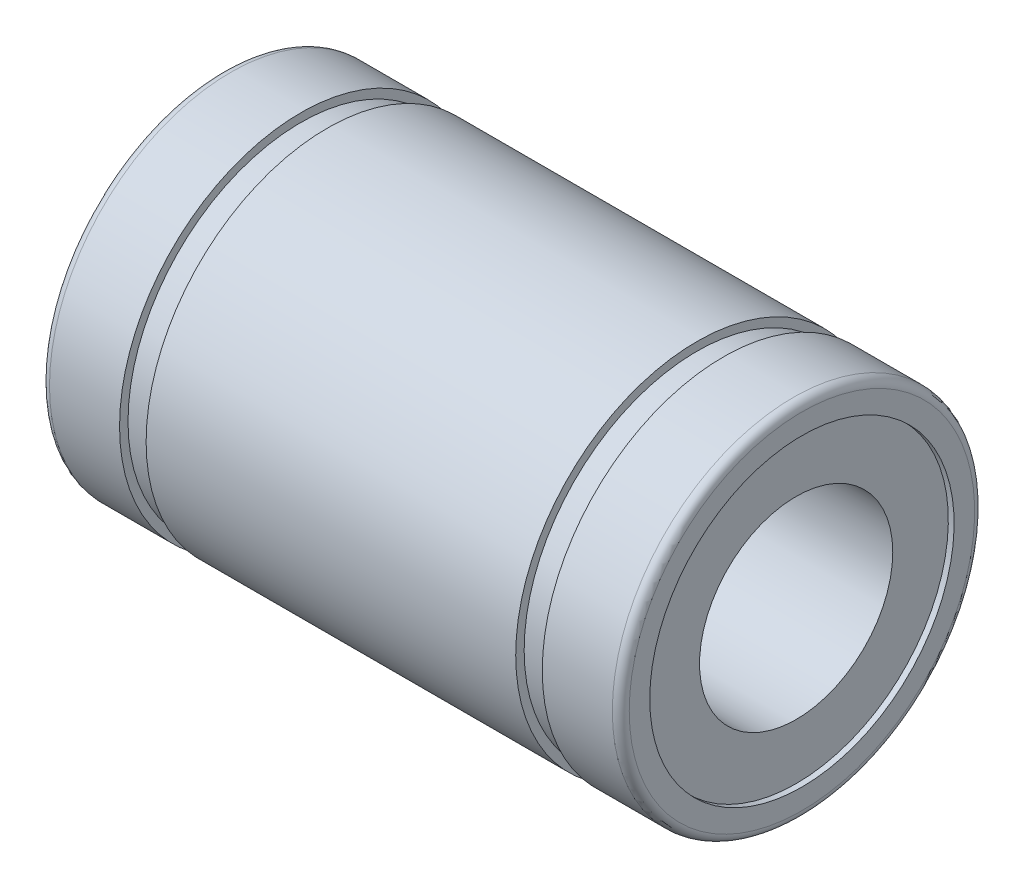
ISO-10303-21;
HEADER;
FILE_DESCRIPTION(('STEP AP214'),'2;1');
FILE_NAME('part.step','',(''),(''),'','','');
FILE_SCHEMA(('AUTOMOTIVE_DESIGN { 1 0 10303 214 1 1 1 1 }'));
ENDSEC;
DATA;
#1=APPLICATION_CONTEXT('core data for automotive mechanical design processes');
#2=APPLICATION_PROTOCOL_DEFINITION('international standard','automotive_design',2000,#1);
#3=PRODUCT_CONTEXT('',#1,'mechanical');
#4=PRODUCT('Part','Part','',(#3));
#5=PRODUCT_RELATED_PRODUCT_CATEGORY('part','',(#4));
#6=PRODUCT_DEFINITION_FORMATION('','',#4);
#7=PRODUCT_DEFINITION_CONTEXT('part definition',#1,'design');
#8=PRODUCT_DEFINITION('design','',#6,#7);
#9=PRODUCT_DEFINITION_SHAPE('','',#8);
#10=(LENGTH_UNIT() NAMED_UNIT(*) SI_UNIT(.MILLI.,.METRE.));
#11=(NAMED_UNIT(*) PLANE_ANGLE_UNIT() SI_UNIT($,.RADIAN.));
#12=(NAMED_UNIT(*) SI_UNIT($,.STERADIAN.) SOLID_ANGLE_UNIT());
#13=UNCERTAINTY_MEASURE_WITH_UNIT(LENGTH_MEASURE(1.E-05),#10,'distance_accuracy_value','');
#14=(GEOMETRIC_REPRESENTATION_CONTEXT(3) GLOBAL_UNCERTAINTY_ASSIGNED_CONTEXT((#13)) GLOBAL_UNIT_ASSIGNED_CONTEXT((#10,
#11,#12)) REPRESENTATION_CONTEXT('',''));
#15=CARTESIAN_POINT('',(0.,0.,0.));
#16=DIRECTION('',(0.,0.,1.));
#17=DIRECTION('',(1.,0.,0.));
#18=AXIS2_PLACEMENT_3D('',#15,#16,#17);
#19=CARTESIAN_POINT('',(-11.65,0.,0.));
#20=DIRECTION('',(-1.,0.,0.));
#21=DIRECTION('',(0.,0.,1.));
#22=AXIS2_PLACEMENT_3D('',#19,#20,#21);
#23=TOROIDAL_SURFACE('',#22,7.15,0.35);
#24=CARTESIAN_POINT('',(-12.,0.,0.));
#25=DIRECTION('',(-1.,0.,0.));
#26=DIRECTION('',(0.,0.,1.));
#27=AXIS2_PLACEMENT_3D('',#24,#25,#26);
#28=CIRCLE('',#27,7.15);
#29=CARTESIAN_POINT('',(-12.,0.,7.15));
#30=VERTEX_POINT('',#29);
#31=EDGE_CURVE('E9',#30,#30,#28,.T.);
#32=ORIENTED_EDGE('',*,*,#31,.F.);
#33=EDGE_LOOP('',(#32));
#34=FACE_BOUND('',#33,.T.);
#35=CARTESIAN_POINT('',(-11.65,0.,0.));
#36=DIRECTION('',(-1.,0.,0.));
#37=DIRECTION('',(0.,0.,1.));
#38=AXIS2_PLACEMENT_3D('',#35,#36,#37);
#39=CIRCLE('',#38,7.5);
#40=CARTESIAN_POINT('',(-11.65,0.,7.5));
#41=VERTEX_POINT('',#40);
#42=EDGE_CURVE('E38',#41,#41,#39,.T.);
#43=ORIENTED_EDGE('',*,*,#42,.T.);
#44=EDGE_LOOP('',(#43));
#45=FACE_BOUND('',#44,.T.);
#46=ADVANCED_FACE('F13',(#34,#45),#23,.T.);
#47=CARTESIAN_POINT('',(-12.,7.15,0.));
#48=DIRECTION('',(1.,0.,0.));
#49=DIRECTION('',(0.,0.,-1.));
#50=AXIS2_PLACEMENT_3D('',#47,#48,#49);
#51=PLANE('',#50);
#52=CARTESIAN_POINT('',(-12.,0.,0.));
#53=DIRECTION('',(1.,0.,0.));
#54=DIRECTION('',(0.,0.,-1.));
#55=AXIS2_PLACEMENT_3D('',#52,#53,#54);
#56=CIRCLE('',#55,6.3);
#57=CARTESIAN_POINT('',(-12.,0.,-6.3));
#58=VERTEX_POINT('',#57);
#59=EDGE_CURVE('E39',#58,#58,#56,.T.);
#60=ORIENTED_EDGE('',*,*,#59,.T.);
#61=EDGE_LOOP('',(#60));
#62=FACE_BOUND('',#61,.T.);
#63=ORIENTED_EDGE('',*,*,#31,.T.);
#64=EDGE_LOOP('',(#63));
#65=FACE_BOUND('',#64,.T.);
#66=ADVANCED_FACE('F107',(#62,#65),#51,.F.);
#67=CARTESIAN_POINT('',(12.,0.,0.));
#68=DIRECTION('',(-1.,0.,0.));
#69=DIRECTION('',(0.,0.,1.));
#70=AXIS2_PLACEMENT_3D('',#67,#68,#69);
#71=PLANE('',#70);
#72=CARTESIAN_POINT('',(12.,0.,0.));
#73=DIRECTION('',(-1.,0.,0.));
#74=DIRECTION('',(0.,0.,1.));
#75=AXIS2_PLACEMENT_3D('',#72,#73,#74);
#76=CIRCLE('',#75,6.3);
#77=CARTESIAN_POINT('',(12.,0.,6.3));
#78=VERTEX_POINT('',#77);
#79=EDGE_CURVE('E35',#78,#78,#76,.T.);
#80=ORIENTED_EDGE('',*,*,#79,.T.);
#81=EDGE_LOOP('',(#80));
#82=FACE_BOUND('',#81,.T.);
#83=CARTESIAN_POINT('',(12.,0.,0.));
#84=DIRECTION('',(-1.,0.,0.));
#85=DIRECTION('',(0.,0.,1.));
#86=AXIS2_PLACEMENT_3D('',#83,#84,#85);
#87=CIRCLE('',#86,7.15);
#88=CARTESIAN_POINT('',(12.,0.,7.15));
#89=VERTEX_POINT('',#88);
#90=EDGE_CURVE('E21',#89,#89,#87,.T.);
#91=ORIENTED_EDGE('',*,*,#90,.F.);
#92=EDGE_LOOP('',(#91));
#93=FACE_BOUND('',#92,.T.);
#94=ADVANCED_FACE('F102',(#82,#93),#71,.F.);
#95=CARTESIAN_POINT('',(11.65,0.,0.));
#96=DIRECTION('',(-1.,0.,0.));
#97=DIRECTION('',(0.,0.,1.));
#98=AXIS2_PLACEMENT_3D('',#95,#96,#97);
#99=TOROIDAL_SURFACE('',#98,7.15,0.35);
#100=CARTESIAN_POINT('',(11.65,0.,0.));
#101=DIRECTION('',(-1.,0.,0.));
#102=DIRECTION('',(0.,0.,1.));
#103=AXIS2_PLACEMENT_3D('',#100,#101,#102);
#104=CIRCLE('',#103,7.5);
#105=CARTESIAN_POINT('',(11.65,0.,7.5));
#106=VERTEX_POINT('',#105);
#107=EDGE_CURVE('E31',#106,#106,#104,.T.);
#108=ORIENTED_EDGE('',*,*,#107,.F.);
#109=EDGE_LOOP('',(#108));
#110=FACE_BOUND('',#109,.T.);
#111=ORIENTED_EDGE('',*,*,#90,.T.);
#112=EDGE_LOOP('',(#111));
#113=FACE_BOUND('',#112,.T.);
#114=ADVANCED_FACE('F99',(#110,#113),#99,.T.);
#115=CARTESIAN_POINT('',(0.,0.,0.));
#116=DIRECTION('',(-1.,0.,0.));
#117=DIRECTION('',(0.,0.,1.));
#118=AXIS2_PLACEMENT_3D('',#115,#116,#117);
#119=CYLINDRICAL_SURFACE('',#118,7.5);
#120=CARTESIAN_POINT('',(8.75,0.,0.));
#121=DIRECTION('',(-1.,0.,0.));
#122=DIRECTION('',(0.,0.,1.));
#123=AXIS2_PLACEMENT_3D('',#120,#121,#122);
#124=CIRCLE('',#123,7.5);
#125=CARTESIAN_POINT('',(8.75,0.,7.5));
#126=VERTEX_POINT('',#125);
#127=EDGE_CURVE('E89',#126,#126,#124,.T.);
#128=ORIENTED_EDGE('',*,*,#127,.F.);
#129=EDGE_LOOP('',(#128));
#130=FACE_BOUND('',#129,.T.);
#131=ORIENTED_EDGE('',*,*,#107,.T.);
#132=EDGE_LOOP('',(#131));
#133=FACE_BOUND('',#132,.T.);
#134=ADVANCED_FACE('F97',(#130,#133),#119,.T.);
#135=CARTESIAN_POINT('',(8.75,7.15,0.));
#136=DIRECTION('',(-1.,0.,0.));
#137=DIRECTION('',(0.,0.,1.));
#138=AXIS2_PLACEMENT_3D('',#135,#136,#137);
#139=PLANE('',#138);
#140=ORIENTED_EDGE('',*,*,#127,.T.);
#141=EDGE_LOOP('',(#140));
#142=FACE_BOUND('',#141,.T.);
#143=CARTESIAN_POINT('',(8.75,0.,0.));
#144=DIRECTION('',(-1.,0.,0.));
#145=DIRECTION('',(0.,0.,1.));
#146=AXIS2_PLACEMENT_3D('',#143,#144,#145);
#147=CIRCLE('',#146,7.15);
#148=CARTESIAN_POINT('',(8.75,0.,7.15));
#149=VERTEX_POINT('',#148);
#150=EDGE_CURVE('E85',#149,#149,#147,.T.);
#151=ORIENTED_EDGE('',*,*,#150,.F.);
#152=EDGE_LOOP('',(#151));
#153=FACE_BOUND('',#152,.T.);
#154=ADVANCED_FACE('F155',(#142,#153),#139,.T.);
#155=CARTESIAN_POINT('',(0.,0.,0.));
#156=DIRECTION('',(-1.,0.,0.));
#157=DIRECTION('',(0.,0.,1.));
#158=AXIS2_PLACEMENT_3D('',#155,#156,#157);
#159=CYLINDRICAL_SURFACE('',#158,7.15);
#160=ORIENTED_EDGE('',*,*,#150,.T.);
#161=EDGE_LOOP('',(#160));
#162=FACE_BOUND('',#161,.T.);
#163=CARTESIAN_POINT('',(7.65,0.,0.));
#164=DIRECTION('',(-1.,0.,0.));
#165=DIRECTION('',(0.,0.,1.));
#166=AXIS2_PLACEMENT_3D('',#163,#164,#165);
#167=CIRCLE('',#166,7.15);
#168=CARTESIAN_POINT('',(7.65,0.,7.15));
#169=VERTEX_POINT('',#168);
#170=EDGE_CURVE('E81',#169,#169,#167,.T.);
#171=ORIENTED_EDGE('',*,*,#170,.F.);
#172=EDGE_LOOP('',(#171));
#173=FACE_BOUND('',#172,.T.);
#174=ADVANCED_FACE('F151',(#162,#173),#159,.T.);
#175=CARTESIAN_POINT('',(7.65,7.5,0.));
#176=DIRECTION('',(1.,0.,0.));
#177=DIRECTION('',(0.,0.,-1.));
#178=AXIS2_PLACEMENT_3D('',#175,#176,#177);
#179=PLANE('',#178);
#180=ORIENTED_EDGE('',*,*,#170,.T.);
#181=EDGE_LOOP('',(#180));
#182=FACE_BOUND('',#181,.T.);
#183=CARTESIAN_POINT('',(7.65,0.,0.));
#184=DIRECTION('',(-1.,0.,0.));
#185=DIRECTION('',(0.,0.,1.));
#186=AXIS2_PLACEMENT_3D('',#183,#184,#185);
#187=CIRCLE('',#186,7.5);
#188=CARTESIAN_POINT('',(7.65,0.,7.5));
#189=VERTEX_POINT('',#188);
#190=EDGE_CURVE('E77',#189,#189,#187,.T.);
#191=ORIENTED_EDGE('',*,*,#190,.F.);
#192=EDGE_LOOP('',(#191));
#193=FACE_BOUND('',#192,.T.);
#194=ADVANCED_FACE('F147',(#182,#193),#179,.T.);
#195=CARTESIAN_POINT('',(0.,0.,0.));
#196=DIRECTION('',(-1.,0.,0.));
#197=DIRECTION('',(0.,0.,1.));
#198=AXIS2_PLACEMENT_3D('',#195,#196,#197);
#199=CYLINDRICAL_SURFACE('',#198,7.5);
#200=CARTESIAN_POINT('',(-7.65,0.,0.));
#201=DIRECTION('',(-1.,0.,0.));
#202=DIRECTION('',(0.,0.,1.));
#203=AXIS2_PLACEMENT_3D('',#200,#201,#202);
#204=CIRCLE('',#203,7.5);
#205=CARTESIAN_POINT('',(-7.65,0.,7.5));
#206=VERTEX_POINT('',#205);
#207=EDGE_CURVE('E73',#206,#206,#204,.T.);
#208=ORIENTED_EDGE('',*,*,#207,.F.);
#209=EDGE_LOOP('',(#208));
#210=FACE_BOUND('',#209,.T.);
#211=ORIENTED_EDGE('',*,*,#190,.T.);
#212=EDGE_LOOP('',(#211));
#213=FACE_BOUND('',#212,.T.);
#214=ADVANCED_FACE('F143',(#210,#213),#199,.T.);
#215=CARTESIAN_POINT('',(-7.65,7.15,0.));
#216=DIRECTION('',(-1.,0.,0.));
#217=DIRECTION('',(0.,0.,1.));
#218=AXIS2_PLACEMENT_3D('',#215,#216,#217);
#219=PLANE('',#218);
#220=ORIENTED_EDGE('',*,*,#207,.T.);
#221=EDGE_LOOP('',(#220));
#222=FACE_BOUND('',#221,.T.);
#223=CARTESIAN_POINT('',(-7.65,0.,0.));
#224=DIRECTION('',(-1.,0.,0.));
#225=DIRECTION('',(0.,0.,1.));
#226=AXIS2_PLACEMENT_3D('',#223,#224,#225);
#227=CIRCLE('',#226,7.15);
#228=CARTESIAN_POINT('',(-7.65,0.,7.15));
#229=VERTEX_POINT('',#228);
#230=EDGE_CURVE('E69',#229,#229,#227,.T.);
#231=ORIENTED_EDGE('',*,*,#230,.F.);
#232=EDGE_LOOP('',(#231));
#233=FACE_BOUND('',#232,.T.);
#234=ADVANCED_FACE('F136',(#222,#233),#219,.T.);
#235=CARTESIAN_POINT('',(0.,0.,0.));
#236=DIRECTION('',(-1.,0.,0.));
#237=DIRECTION('',(0.,0.,1.));
#238=AXIS2_PLACEMENT_3D('',#235,#236,#237);
#239=CYLINDRICAL_SURFACE('',#238,7.15);
#240=ORIENTED_EDGE('',*,*,#230,.T.);
#241=EDGE_LOOP('',(#240));
#242=FACE_BOUND('',#241,.T.);
#243=CARTESIAN_POINT('',(-8.75,0.,0.));
#244=DIRECTION('',(-1.,0.,0.));
#245=DIRECTION('',(0.,0.,1.));
#246=AXIS2_PLACEMENT_3D('',#243,#244,#245);
#247=CIRCLE('',#246,7.15);
#248=CARTESIAN_POINT('',(-8.75,0.,7.15));
#249=VERTEX_POINT('',#248);
#250=EDGE_CURVE('E65',#249,#249,#247,.T.);
#251=ORIENTED_EDGE('',*,*,#250,.F.);
#252=EDGE_LOOP('',(#251));
#253=FACE_BOUND('',#252,.T.);
#254=ADVANCED_FACE('F130',(#242,#253),#239,.T.);
#255=CARTESIAN_POINT('',(-8.75,7.5,0.));
#256=DIRECTION('',(1.,0.,0.));
#257=DIRECTION('',(0.,0.,-1.));
#258=AXIS2_PLACEMENT_3D('',#255,#256,#257);
#259=PLANE('',#258);
#260=ORIENTED_EDGE('',*,*,#250,.T.);
#261=EDGE_LOOP('',(#260));
#262=FACE_BOUND('',#261,.T.);
#263=CARTESIAN_POINT('',(-8.75,0.,0.));
#264=DIRECTION('',(-1.,0.,0.));
#265=DIRECTION('',(0.,0.,1.));
#266=AXIS2_PLACEMENT_3D('',#263,#264,#265);
#267=CIRCLE('',#266,7.5);
#268=CARTESIAN_POINT('',(-8.75,0.,7.5));
#269=VERTEX_POINT('',#268);
#270=EDGE_CURVE('E62',#269,#269,#267,.T.);
#271=ORIENTED_EDGE('',*,*,#270,.F.);
#272=EDGE_LOOP('',(#271));
#273=FACE_BOUND('',#272,.T.);
#274=ADVANCED_FACE('F125',(#262,#273),#259,.T.);
#275=CARTESIAN_POINT('',(0.,0.,0.));
#276=DIRECTION('',(-1.,0.,0.));
#277=DIRECTION('',(0.,0.,1.));
#278=AXIS2_PLACEMENT_3D('',#275,#276,#277);
#279=CYLINDRICAL_SURFACE('',#278,7.5);
#280=ORIENTED_EDGE('',*,*,#42,.F.);
#281=EDGE_LOOP('',(#280));
#282=FACE_BOUND('',#281,.T.);
#283=ORIENTED_EDGE('',*,*,#270,.T.);
#284=EDGE_LOOP('',(#283));
#285=FACE_BOUND('',#284,.T.);
#286=ADVANCED_FACE('F121',(#282,#285),#279,.T.);
#287=CARTESIAN_POINT('',(10.8,0.,0.));
#288=DIRECTION('',(1.,0.,0.));
#289=DIRECTION('',(0.,-1.,0.));
#290=AXIS2_PLACEMENT_3D('',#287,#288,#289);
#291=CYLINDRICAL_SURFACE('',#290,6.3);
#292=CARTESIAN_POINT('',(11.76,0.,0.));
#293=DIRECTION('',(-1.,0.,0.));
#294=DIRECTION('',(0.,-1.,0.));
#295=AXIS2_PLACEMENT_3D('',#292,#293,#294);
#296=CIRCLE('',#295,6.3);
#297=CARTESIAN_POINT('',(11.76,-6.3,0.));
#298=VERTEX_POINT('',#297);
#299=EDGE_CURVE('E42',#298,#298,#296,.T.);
#300=ORIENTED_EDGE('',*,*,#299,.T.);
#301=EDGE_LOOP('',(#300));
#302=FACE_BOUND('',#301,.T.);
#303=ORIENTED_EDGE('',*,*,#79,.F.);
#304=EDGE_LOOP('',(#303));
#305=FACE_BOUND('',#304,.T.);
#306=ADVANCED_FACE('F124',(#302,#305),#291,.F.);
#307=CARTESIAN_POINT('',(-10.8,0.,0.));
#308=DIRECTION('',(-1.,0.,0.));
#309=DIRECTION('',(0.,-1.,0.));
#310=AXIS2_PLACEMENT_3D('',#307,#308,#309);
#311=CYLINDRICAL_SURFACE('',#310,6.3);
#312=CARTESIAN_POINT('',(-11.76,0.,0.));
#313=DIRECTION('',(1.,0.,0.));
#314=DIRECTION('',(0.,-1.,0.));
#315=AXIS2_PLACEMENT_3D('',#312,#313,#314);
#316=CIRCLE('',#315,6.3);
#317=CARTESIAN_POINT('',(-11.76,-6.3,0.));
#318=VERTEX_POINT('',#317);
#319=EDGE_CURVE('E48',#318,#318,#316,.T.);
#320=ORIENTED_EDGE('',*,*,#319,.T.);
#321=EDGE_LOOP('',(#320));
#322=FACE_BOUND('',#321,.T.);
#323=ORIENTED_EDGE('',*,*,#59,.F.);
#324=EDGE_LOOP('',(#323));
#325=FACE_BOUND('',#324,.T.);
#326=ADVANCED_FACE('F222',(#322,#325),#311,.F.);
#327=CARTESIAN_POINT('',(11.76,0.,0.));
#328=DIRECTION('',(1.,0.,0.));
#329=DIRECTION('',(0.,0.,-1.));
#330=AXIS2_PLACEMENT_3D('',#327,#328,#329);
#331=PLANE('',#330);
#332=CARTESIAN_POINT('',(11.76,0.,0.));
#333=DIRECTION('',(1.,0.,0.));
#334=DIRECTION('',(0.,0.,-1.));
#335=AXIS2_PLACEMENT_3D('',#332,#333,#334);
#336=CIRCLE('',#335,4.);
#337=CARTESIAN_POINT('',(11.76,0.,-4.));
#338=VERTEX_POINT('',#337);
#339=EDGE_CURVE('E56',#338,#338,#336,.T.);
#340=ORIENTED_EDGE('',*,*,#339,.F.);
#341=EDGE_LOOP('',(#340));
#342=FACE_BOUND('',#341,.T.);
#343=ORIENTED_EDGE('',*,*,#299,.F.);
#344=EDGE_LOOP('',(#343));
#345=FACE_BOUND('',#344,.T.);
#346=ADVANCED_FACE('F230',(#342,#345),#331,.T.);
#347=CARTESIAN_POINT('',(-11.76,0.,0.));
#348=DIRECTION('',(-1.,0.,0.));
#349=DIRECTION('',(0.,0.,1.));
#350=AXIS2_PLACEMENT_3D('',#347,#348,#349);
#351=PLANE('',#350);
#352=CARTESIAN_POINT('',(-11.76,0.,0.));
#353=DIRECTION('',(-1.,0.,0.));
#354=DIRECTION('',(0.,0.,1.));
#355=AXIS2_PLACEMENT_3D('',#352,#353,#354);
#356=CIRCLE('',#355,4.);
#357=CARTESIAN_POINT('',(-11.76,0.,4.));
#358=VERTEX_POINT('',#357);
#359=EDGE_CURVE('E16',#358,#358,#356,.T.);
#360=ORIENTED_EDGE('',*,*,#359,.F.);
#361=EDGE_LOOP('',(#360));
#362=FACE_BOUND('',#361,.T.);
#363=ORIENTED_EDGE('',*,*,#319,.F.);
#364=EDGE_LOOP('',(#363));
#365=FACE_BOUND('',#364,.T.);
#366=ADVANCED_FACE('F240',(#362,#365),#351,.T.);
#367=CARTESIAN_POINT('',(-24.,0.,0.));
#368=DIRECTION('',(1.,0.,0.));
#369=DIRECTION('',(0.,-1.,0.));
#370=AXIS2_PLACEMENT_3D('',#367,#368,#369);
#371=CYLINDRICAL_SURFACE('',#370,4.);
#372=ORIENTED_EDGE('',*,*,#339,.T.);
#373=EDGE_LOOP('',(#372));
#374=FACE_BOUND('',#373,.T.);
#375=ORIENTED_EDGE('',*,*,#359,.T.);
#376=EDGE_LOOP('',(#375));
#377=FACE_BOUND('',#376,.T.);
#378=ADVANCED_FACE('F249',(#374,#377),#371,.F.);
#379=CLOSED_SHELL('',(#46,#66,#94,#114,#134,#154,#174,#194,#214,#234,#254,#274,#286,#306,#326,
#346,#366,#378));
#380=MANIFOLD_SOLID_BREP('B1',#379);
#381=ADVANCED_BREP_SHAPE_REPRESENTATION('',(#18,#380),#14);
#382=SHAPE_DEFINITION_REPRESENTATION(#9,#381);
ENDSEC;
END-ISO-10303-21;
